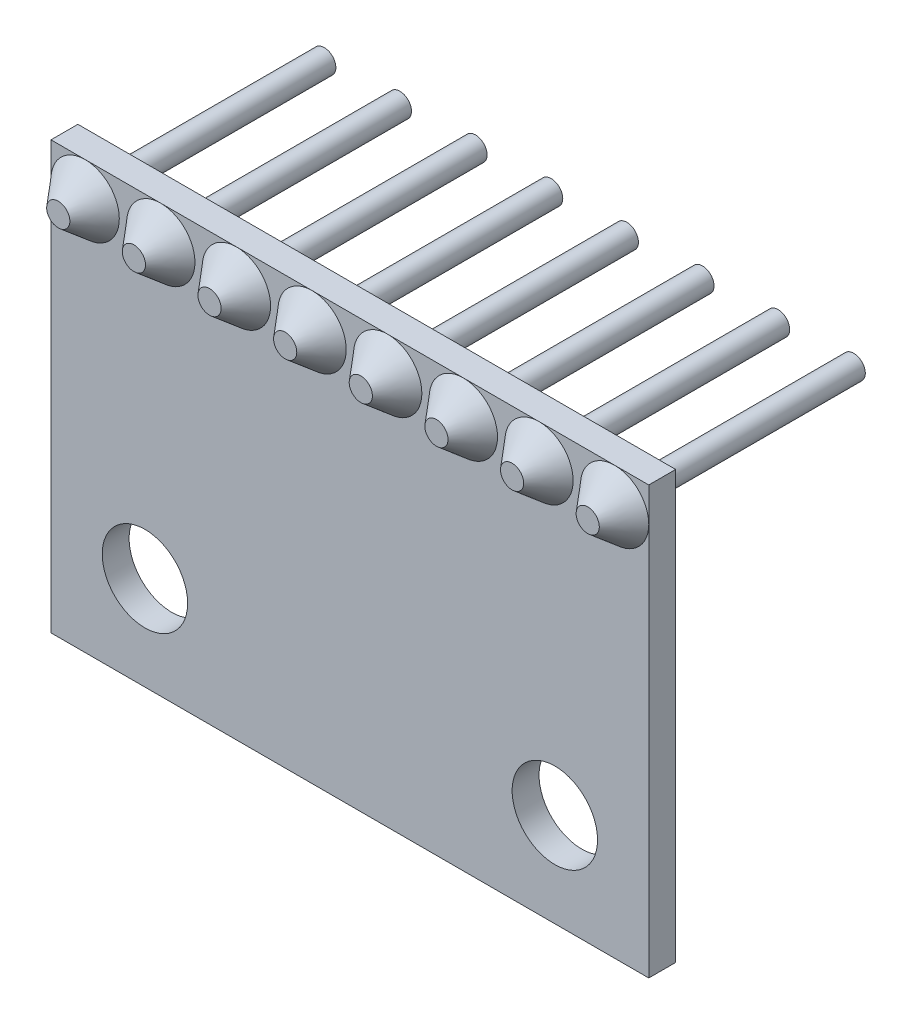
ISO-10303-21;
HEADER;
FILE_DESCRIPTION(('STEP AP214'),'2;1');
FILE_NAME('part.step','',(''),(''),'','','');
FILE_SCHEMA(('AUTOMOTIVE_DESIGN { 1 0 10303 214 1 1 1 1 }'));
ENDSEC;
DATA;
#1=APPLICATION_CONTEXT('core data for automotive mechanical design processes');
#2=APPLICATION_PROTOCOL_DEFINITION('international standard','automotive_design',2000,#1);
#3=PRODUCT_CONTEXT('',#1,'mechanical');
#4=PRODUCT('Part','Part','',(#3));
#5=PRODUCT_RELATED_PRODUCT_CATEGORY('part','',(#4));
#6=PRODUCT_DEFINITION_FORMATION('','',#4);
#7=PRODUCT_DEFINITION_CONTEXT('part definition',#1,'design');
#8=PRODUCT_DEFINITION('design','',#6,#7);
#9=PRODUCT_DEFINITION_SHAPE('','',#8);
#10=(LENGTH_UNIT() NAMED_UNIT(*) SI_UNIT(.MILLI.,.METRE.));
#11=(NAMED_UNIT(*) PLANE_ANGLE_UNIT() SI_UNIT($,.RADIAN.));
#12=(NAMED_UNIT(*) SI_UNIT($,.STERADIAN.) SOLID_ANGLE_UNIT());
#13=UNCERTAINTY_MEASURE_WITH_UNIT(LENGTH_MEASURE(1.E-05),#10,'distance_accuracy_value','');
#14=(GEOMETRIC_REPRESENTATION_CONTEXT(3) GLOBAL_UNCERTAINTY_ASSIGNED_CONTEXT((#13)) GLOBAL_UNIT_ASSIGNED_CONTEXT((#10,
#11,#12)) REPRESENTATION_CONTEXT('',''));
#15=CARTESIAN_POINT('',(0.,0.,0.));
#16=DIRECTION('',(0.,0.,1.));
#17=DIRECTION('',(1.,0.,0.));
#18=AXIS2_PLACEMENT_3D('',#15,#16,#17);
#19=CARTESIAN_POINT('',(0.,0.,1.));
#20=DIRECTION('',(0.,0.,1.));
#21=DIRECTION('',(1.,0.,0.));
#22=AXIS2_PLACEMENT_3D('',#19,#20,#21);
#23=PLANE('',#22);
#24=CARTESIAN_POINT('',(-3.4925,3.4925,1.));
#25=DIRECTION('',(0.,0.,1.));
#26=DIRECTION('',(1.,0.,0.));
#27=AXIS2_PLACEMENT_3D('',#24,#25,#26);
#28=CIRCLE('',#27,1.5875);
#29=CARTESIAN_POINT('',(-1.905,3.4925,1.));
#30=VERTEX_POINT('',#29);
#31=EDGE_CURVE('E251',#30,#30,#28,.T.);
#32=ORIENTED_EDGE('',*,*,#31,.F.);
#33=EDGE_LOOP('',(#32));
#34=FACE_BOUND('',#33,.T.);
#35=CARTESIAN_POINT('',(-18.7325,3.4925,1.));
#36=DIRECTION('',(0.,0.,1.));
#37=DIRECTION('',(1.,0.,0.));
#38=AXIS2_PLACEMENT_3D('',#35,#36,#37);
#39=CIRCLE('',#38,1.5875);
#40=CARTESIAN_POINT('',(-17.145,3.4925,1.));
#41=VERTEX_POINT('',#40);
#42=EDGE_CURVE('E257',#41,#41,#39,.T.);
#43=ORIENTED_EDGE('',*,*,#42,.F.);
#44=EDGE_LOOP('',(#43));
#45=FACE_BOUND('',#44,.T.);
#46=DIRECTION('',(0.,1.,0.));
#47=VECTOR('',#46,1.);
#48=CARTESIAN_POINT('',(0.,0.,1.));
#49=LINE('',#48,#47);
#50=CARTESIAN_POINT('',(0.,0.,1.));
#51=VERTEX_POINT('',#50);
#52=CARTESIAN_POINT('',(0.,14.605,1.));
#53=VERTEX_POINT('',#52);
#54=EDGE_CURVE('E135',#51,#53,#49,.T.);
#55=ORIENTED_EDGE('',*,*,#54,.T.);
#56=CARTESIAN_POINT('',(-1.27,14.605,1.));
#57=DIRECTION('',(0.,0.,1.));
#58=DIRECTION('',(1.,0.,0.));
#59=AXIS2_PLACEMENT_3D('',#56,#57,#58);
#60=CIRCLE('',#59,1.27);
#61=CARTESIAN_POINT('',(-1.27,15.875,1.));
#62=VERTEX_POINT('',#61);
#63=EDGE_CURVE('E47',#62,#53,#60,.T.);
#64=ORIENTED_EDGE('',*,*,#63,.F.);
#65=DIRECTION('',(-1.,0.,0.));
#66=VECTOR('',#65,1.);
#67=CARTESIAN_POINT('',(0.,15.875,1.));
#68=LINE('',#67,#66);
#69=CARTESIAN_POINT('',(-4.08214285714286,15.875,1.));
#70=VERTEX_POINT('',#69);
#71=EDGE_CURVE('E54',#62,#70,#68,.T.);
#72=ORIENTED_EDGE('',*,*,#71,.T.);
#73=CARTESIAN_POINT('',(-4.08214285714286,14.605,1.));
#74=DIRECTION('',(0.,0.,1.));
#75=DIRECTION('',(1.,0.,0.));
#76=AXIS2_PLACEMENT_3D('',#73,#74,#75);
#77=CIRCLE('',#76,1.27);
#78=EDGE_CURVE('E178',#70,#70,#77,.T.);
#79=ORIENTED_EDGE('',*,*,#78,.F.);
#80=CARTESIAN_POINT('',(-6.89428571428571,15.875,1.));
#81=VERTEX_POINT('',#80);
#82=EDGE_CURVE('E144',#70,#81,#68,.T.);
#83=ORIENTED_EDGE('',*,*,#82,.T.);
#84=CARTESIAN_POINT('',(-6.89428571428571,14.605,1.));
#85=DIRECTION('',(0.,0.,1.));
#86=DIRECTION('',(1.,0.,0.));
#87=AXIS2_PLACEMENT_3D('',#84,#85,#86);
#88=CIRCLE('',#87,1.27);
#89=EDGE_CURVE('E177',#81,#81,#88,.T.);
#90=ORIENTED_EDGE('',*,*,#89,.F.);
#91=CARTESIAN_POINT('',(-9.70642857142857,15.875,1.));
#92=VERTEX_POINT('',#91);
#93=EDGE_CURVE('E170',#81,#92,#68,.T.);
#94=ORIENTED_EDGE('',*,*,#93,.T.);
#95=CARTESIAN_POINT('',(-9.70642857142857,14.605,1.));
#96=DIRECTION('',(0.,0.,1.));
#97=DIRECTION('',(1.,0.,0.));
#98=AXIS2_PLACEMENT_3D('',#95,#96,#97);
#99=CIRCLE('',#98,1.27);
#100=EDGE_CURVE('E185',#92,#92,#99,.T.);
#101=ORIENTED_EDGE('',*,*,#100,.F.);
#102=CARTESIAN_POINT('',(-12.5185714285714,15.875,1.));
#103=VERTEX_POINT('',#102);
#104=EDGE_CURVE('E165',#92,#103,#68,.T.);
#105=ORIENTED_EDGE('',*,*,#104,.T.);
#106=CARTESIAN_POINT('',(-12.5185714285714,14.605,1.));
#107=DIRECTION('',(0.,0.,1.));
#108=DIRECTION('',(1.,0.,0.));
#109=AXIS2_PLACEMENT_3D('',#106,#107,#108);
#110=CIRCLE('',#109,1.27);
#111=EDGE_CURVE('E195',#103,#103,#110,.T.);
#112=ORIENTED_EDGE('',*,*,#111,.F.);
#113=CARTESIAN_POINT('',(-15.3307142857143,15.875,1.));
#114=VERTEX_POINT('',#113);
#115=EDGE_CURVE('E159',#103,#114,#68,.T.);
#116=ORIENTED_EDGE('',*,*,#115,.T.);
#117=CARTESIAN_POINT('',(-15.3307142857143,14.605,1.));
#118=DIRECTION('',(0.,0.,1.));
#119=DIRECTION('',(1.,0.,0.));
#120=AXIS2_PLACEMENT_3D('',#117,#118,#119);
#121=CIRCLE('',#120,1.27);
#122=EDGE_CURVE('E206',#114,#114,#121,.T.);
#123=ORIENTED_EDGE('',*,*,#122,.F.);
#124=CARTESIAN_POINT('',(-18.1428571428571,15.875,1.));
#125=VERTEX_POINT('',#124);
#126=EDGE_CURVE('E154',#114,#125,#68,.T.);
#127=ORIENTED_EDGE('',*,*,#126,.T.);
#128=CARTESIAN_POINT('',(-18.1428571428571,14.605,1.));
#129=DIRECTION('',(0.,0.,1.));
#130=DIRECTION('',(1.,0.,0.));
#131=AXIS2_PLACEMENT_3D('',#128,#129,#130);
#132=CIRCLE('',#131,1.27);
#133=EDGE_CURVE('E211',#125,#125,#132,.T.);
#134=ORIENTED_EDGE('',*,*,#133,.F.);
#135=CARTESIAN_POINT('',(-20.955,15.875,1.));
#136=VERTEX_POINT('',#135);
#137=EDGE_CURVE('E149',#125,#136,#68,.T.);
#138=ORIENTED_EDGE('',*,*,#137,.T.);
#139=CARTESIAN_POINT('',(-20.955,14.605,1.));
#140=DIRECTION('',(0.,0.,1.));
#141=DIRECTION('',(1.,0.,0.));
#142=AXIS2_PLACEMENT_3D('',#139,#140,#141);
#143=CIRCLE('',#142,1.27);
#144=CARTESIAN_POINT('',(-22.225,14.605,1.));
#145=VERTEX_POINT('',#144);
#146=EDGE_CURVE('E200',#145,#136,#143,.T.);
#147=ORIENTED_EDGE('',*,*,#146,.F.);
#148=DIRECTION('',(0.,-1.,0.));
#149=VECTOR('',#148,1.);
#150=CARTESIAN_POINT('',(-22.225,0.,1.));
#151=LINE('',#150,#149);
#152=CARTESIAN_POINT('',(-22.225,0.,1.));
#153=VERTEX_POINT('',#152);
#154=EDGE_CURVE('E148',#145,#153,#151,.T.);
#155=ORIENTED_EDGE('',*,*,#154,.T.);
#156=DIRECTION('',(1.,0.,0.));
#157=VECTOR('',#156,1.);
#158=CARTESIAN_POINT('',(0.,0.,1.));
#159=LINE('',#158,#157);
#160=EDGE_CURVE('E302',#153,#51,#159,.T.);
#161=ORIENTED_EDGE('',*,*,#160,.T.);
#162=EDGE_LOOP('',(#55,#64,#72,#79,#83,#90,#94,#101,#105,#112,#116,#123,#127,#134,#138,#147,
#155,#161));
#163=FACE_BOUND('',#162,.T.);
#164=ADVANCED_FACE('F33',(#34,#45,#163),#23,.T.);
#165=CARTESIAN_POINT('',(0.,15.875,1.));
#166=VERTEX_POINT('',#165);
#167=EDGE_CURVE('E141',#166,#62,#68,.T.);
#168=ORIENTED_EDGE('',*,*,#167,.T.);
#169=EDGE_CURVE('E126',#53,#62,#60,.T.);
#170=ORIENTED_EDGE('',*,*,#169,.F.);
#171=EDGE_CURVE('E147',#53,#166,#49,.T.);
#172=ORIENTED_EDGE('',*,*,#171,.T.);
#173=EDGE_LOOP('',(#168,#170,#172));
#174=FACE_BOUND('',#173,.T.);
#175=ADVANCED_FACE('F146',(#174),#23,.T.);
#176=CARTESIAN_POINT('',(-22.225,15.875,1.));
#177=VERTEX_POINT('',#176);
#178=EDGE_CURVE('E150',#177,#145,#151,.T.);
#179=ORIENTED_EDGE('',*,*,#178,.T.);
#180=EDGE_CURVE('E201',#136,#145,#143,.T.);
#181=ORIENTED_EDGE('',*,*,#180,.F.);
#182=EDGE_CURVE('E155',#136,#177,#68,.T.);
#183=ORIENTED_EDGE('',*,*,#182,.T.);
#184=EDGE_LOOP('',(#179,#181,#183));
#185=FACE_BOUND('',#184,.T.);
#186=ADVANCED_FACE('F286',(#185),#23,.T.);
#187=CARTESIAN_POINT('',(0.,0.,0.));
#188=DIRECTION('',(0.,0.,1.));
#189=DIRECTION('',(1.,0.,0.));
#190=AXIS2_PLACEMENT_3D('',#187,#188,#189);
#191=PLANE('',#190);
#192=CARTESIAN_POINT('',(-1.27,14.605,0.));
#193=DIRECTION('',(0.,0.,1.));
#194=DIRECTION('',(1.,0.,0.));
#195=AXIS2_PLACEMENT_3D('',#192,#193,#194);
#196=CIRCLE('',#195,0.430900368822718);
#197=CARTESIAN_POINT('',(-0.839099631177282,14.605,0.));
#198=VERTEX_POINT('',#197);
#199=EDGE_CURVE('E810',#198,#198,#196,.T.);
#200=ORIENTED_EDGE('',*,*,#199,.T.);
#201=EDGE_LOOP('',(#200));
#202=FACE_BOUND('',#201,.T.);
#203=CARTESIAN_POINT('',(-4.08214285714286,14.605,0.));
#204=DIRECTION('',(0.,0.,1.));
#205=DIRECTION('',(1.,0.,0.));
#206=AXIS2_PLACEMENT_3D('',#203,#204,#205);
#207=CIRCLE('',#206,0.430900368822718);
#208=CARTESIAN_POINT('',(-3.65124248832014,14.605,0.));
#209=VERTEX_POINT('',#208);
#210=EDGE_CURVE('E804',#209,#209,#207,.T.);
#211=ORIENTED_EDGE('',*,*,#210,.T.);
#212=EDGE_LOOP('',(#211));
#213=FACE_BOUND('',#212,.T.);
#214=CARTESIAN_POINT('',(-6.89428571428571,14.605,0.));
#215=DIRECTION('',(0.,0.,1.));
#216=DIRECTION('',(1.,0.,0.));
#217=AXIS2_PLACEMENT_3D('',#214,#215,#216);
#218=CIRCLE('',#217,0.430900368822718);
#219=CARTESIAN_POINT('',(-6.463385345463,14.605,0.));
#220=VERTEX_POINT('',#219);
#221=EDGE_CURVE('E798',#220,#220,#218,.T.);
#222=ORIENTED_EDGE('',*,*,#221,.T.);
#223=EDGE_LOOP('',(#222));
#224=FACE_BOUND('',#223,.T.);
#225=CARTESIAN_POINT('',(-9.70642857142857,14.605,0.));
#226=DIRECTION('',(0.,0.,1.));
#227=DIRECTION('',(1.,0.,0.));
#228=AXIS2_PLACEMENT_3D('',#225,#226,#227);
#229=CIRCLE('',#228,0.430900368822719);
#230=CARTESIAN_POINT('',(-9.27552820260585,14.605,0.));
#231=VERTEX_POINT('',#230);
#232=EDGE_CURVE('E792',#231,#231,#229,.T.);
#233=ORIENTED_EDGE('',*,*,#232,.T.);
#234=EDGE_LOOP('',(#233));
#235=FACE_BOUND('',#234,.T.);
#236=CARTESIAN_POINT('',(-12.5185714285714,14.605,0.));
#237=DIRECTION('',(0.,0.,1.));
#238=DIRECTION('',(1.,0.,0.));
#239=AXIS2_PLACEMENT_3D('',#236,#237,#238);
#240=CIRCLE('',#239,0.430900368822719);
#241=CARTESIAN_POINT('',(-12.0876710597487,14.605,0.));
#242=VERTEX_POINT('',#241);
#243=EDGE_CURVE('E786',#242,#242,#240,.T.);
#244=ORIENTED_EDGE('',*,*,#243,.T.);
#245=EDGE_LOOP('',(#244));
#246=FACE_BOUND('',#245,.T.);
#247=CARTESIAN_POINT('',(-15.3307142857143,14.605,0.));
#248=DIRECTION('',(0.,0.,1.));
#249=DIRECTION('',(1.,0.,0.));
#250=AXIS2_PLACEMENT_3D('',#247,#248,#249);
#251=CIRCLE('',#250,0.430900368822719);
#252=CARTESIAN_POINT('',(-14.8998139168916,14.605,0.));
#253=VERTEX_POINT('',#252);
#254=EDGE_CURVE('E780',#253,#253,#251,.T.);
#255=ORIENTED_EDGE('',*,*,#254,.T.);
#256=EDGE_LOOP('',(#255));
#257=FACE_BOUND('',#256,.T.);
#258=CARTESIAN_POINT('',(-18.1428571428571,14.605,0.));
#259=DIRECTION('',(0.,0.,1.));
#260=DIRECTION('',(1.,0.,0.));
#261=AXIS2_PLACEMENT_3D('',#258,#259,#260);
#262=CIRCLE('',#261,0.430900368822719);
#263=CARTESIAN_POINT('',(-17.7119567740344,14.605,0.));
#264=VERTEX_POINT('',#263);
#265=EDGE_CURVE('E774',#264,#264,#262,.T.);
#266=ORIENTED_EDGE('',*,*,#265,.T.);
#267=EDGE_LOOP('',(#266));
#268=FACE_BOUND('',#267,.T.);
#269=CARTESIAN_POINT('',(-20.955,14.605,0.));
#270=DIRECTION('',(0.,0.,1.));
#271=DIRECTION('',(1.,0.,0.));
#272=AXIS2_PLACEMENT_3D('',#269,#270,#271);
#273=CIRCLE('',#272,0.430900368822719);
#274=CARTESIAN_POINT('',(-20.5240996311773,14.605,0.));
#275=VERTEX_POINT('',#274);
#276=EDGE_CURVE('E136',#275,#275,#273,.T.);
#277=ORIENTED_EDGE('',*,*,#276,.T.);
#278=EDGE_LOOP('',(#277));
#279=FACE_BOUND('',#278,.T.);
#280=DIRECTION('',(-1.,0.,0.));
#281=VECTOR('',#280,1.);
#282=CARTESIAN_POINT('',(-9.6125,11.8127155405457,0.));
#283=LINE('',#282,#281);
#284=CARTESIAN_POINT('',(-9.6125,11.8127155405457,0.));
#285=VERTEX_POINT('',#284);
#286=CARTESIAN_POINT('',(-12.6125,11.8127155405457,0.));
#287=VERTEX_POINT('',#286);
#288=EDGE_CURVE('E222',#285,#287,#283,.T.);
#289=ORIENTED_EDGE('',*,*,#288,.T.);
#290=DIRECTION('',(0.,-1.,0.));
#291=VECTOR('',#290,1.);
#292=CARTESIAN_POINT('',(-12.6125,11.8127155405457,0.));
#293=LINE('',#292,#291);
#294=CARTESIAN_POINT('',(-12.6125,7.81271554054567,0.));
#295=VERTEX_POINT('',#294);
#296=EDGE_CURVE('E217',#287,#295,#293,.T.);
#297=ORIENTED_EDGE('',*,*,#296,.T.);
#298=DIRECTION('',(1.,0.,0.));
#299=VECTOR('',#298,1.);
#300=CARTESIAN_POINT('',(-12.6125,7.81271554054567,0.));
#301=LINE('',#300,#299);
#302=CARTESIAN_POINT('',(-9.6125,7.81271554054567,0.));
#303=VERTEX_POINT('',#302);
#304=EDGE_CURVE('E234',#295,#303,#301,.T.);
#305=ORIENTED_EDGE('',*,*,#304,.T.);
#306=DIRECTION('',(0.,1.,0.));
#307=VECTOR('',#306,1.);
#308=CARTESIAN_POINT('',(-9.6125,11.8127155405457,0.));
#309=LINE('',#308,#307);
#310=EDGE_CURVE('E237',#303,#285,#309,.T.);
#311=ORIENTED_EDGE('',*,*,#310,.T.);
#312=EDGE_LOOP('',(#289,#297,#305,#311));
#313=FACE_BOUND('',#312,.T.);
#314=CARTESIAN_POINT('',(-18.7325,3.4925,0.));
#315=DIRECTION('',(0.,0.,1.));
#316=DIRECTION('',(1.,0.,0.));
#317=AXIS2_PLACEMENT_3D('',#314,#315,#316);
#318=CIRCLE('',#317,1.5875);
#319=CARTESIAN_POINT('',(-17.145,3.4925,0.));
#320=VERTEX_POINT('',#319);
#321=EDGE_CURVE('E254',#320,#320,#318,.T.);
#322=ORIENTED_EDGE('',*,*,#321,.T.);
#323=EDGE_LOOP('',(#322));
#324=FACE_BOUND('',#323,.T.);
#325=DIRECTION('',(0.,1.,0.));
#326=VECTOR('',#325,1.);
#327=CARTESIAN_POINT('',(0.,0.,0.));
#328=LINE('',#327,#326);
#329=CARTESIAN_POINT('',(0.,0.,0.));
#330=VERTEX_POINT('',#329);
#331=CARTESIAN_POINT('',(0.,15.875,0.));
#332=VERTEX_POINT('',#331);
#333=EDGE_CURVE('E260',#330,#332,#328,.T.);
#334=ORIENTED_EDGE('',*,*,#333,.F.);
#335=DIRECTION('',(1.,0.,0.));
#336=VECTOR('',#335,1.);
#337=CARTESIAN_POINT('',(0.,0.,0.));
#338=LINE('',#337,#336);
#339=CARTESIAN_POINT('',(-22.225,0.,0.));
#340=VERTEX_POINT('',#339);
#341=EDGE_CURVE('E312',#340,#330,#338,.T.);
#342=ORIENTED_EDGE('',*,*,#341,.F.);
#343=DIRECTION('',(0.,-1.,0.));
#344=VECTOR('',#343,1.);
#345=CARTESIAN_POINT('',(-22.225,0.,0.));
#346=LINE('',#345,#344);
#347=CARTESIAN_POINT('',(-22.225,15.875,0.));
#348=VERTEX_POINT('',#347);
#349=EDGE_CURVE('E310',#348,#340,#346,.T.);
#350=ORIENTED_EDGE('',*,*,#349,.F.);
#351=DIRECTION('',(-1.,0.,0.));
#352=VECTOR('',#351,1.);
#353=CARTESIAN_POINT('',(0.,15.875,0.));
#354=LINE('',#353,#352);
#355=EDGE_CURVE('E308',#332,#348,#354,.T.);
#356=ORIENTED_EDGE('',*,*,#355,.F.);
#357=EDGE_LOOP('',(#334,#342,#350,#356));
#358=FACE_BOUND('',#357,.T.);
#359=CARTESIAN_POINT('',(-3.4925,3.4925,0.));
#360=DIRECTION('',(0.,0.,1.));
#361=DIRECTION('',(1.,0.,0.));
#362=AXIS2_PLACEMENT_3D('',#359,#360,#361);
#363=CIRCLE('',#362,1.5875);
#364=CARTESIAN_POINT('',(-1.905,3.4925,0.));
#365=VERTEX_POINT('',#364);
#366=EDGE_CURVE('E244',#365,#365,#363,.T.);
#367=ORIENTED_EDGE('',*,*,#366,.T.);
#368=EDGE_LOOP('',(#367));
#369=FACE_BOUND('',#368,.T.);
#370=ADVANCED_FACE('F264',(#202,#213,#224,#235,#246,#257,#268,#279,#313,#324,#358,#369),#191,.F.);
#371=CARTESIAN_POINT('',(0.,0.,1.));
#372=DIRECTION('',(-1.,0.,0.));
#373=DIRECTION('',(0.,0.,1.));
#374=AXIS2_PLACEMENT_3D('',#371,#372,#373);
#375=PLANE('',#374);
#376=ORIENTED_EDGE('',*,*,#333,.T.);
#377=DIRECTION('',(0.,0.,-1.));
#378=VECTOR('',#377,1.);
#379=CARTESIAN_POINT('',(0.,15.875,1.));
#380=LINE('',#379,#378);
#381=EDGE_CURVE('E11',#166,#332,#380,.T.);
#382=ORIENTED_EDGE('',*,*,#381,.F.);
#383=ORIENTED_EDGE('',*,*,#171,.F.);
#384=ORIENTED_EDGE('',*,*,#54,.F.);
#385=DIRECTION('',(0.,0.,-1.));
#386=VECTOR('',#385,1.);
#387=CARTESIAN_POINT('',(0.,0.,1.));
#388=LINE('',#387,#386);
#389=EDGE_CURVE('E303',#51,#330,#388,.T.);
#390=ORIENTED_EDGE('',*,*,#389,.T.);
#391=EDGE_LOOP('',(#376,#382,#383,#384,#390));
#392=FACE_BOUND('',#391,.T.);
#393=ADVANCED_FACE('F35',(#392),#375,.F.);
#394=CARTESIAN_POINT('',(0.,15.875,1.));
#395=DIRECTION('',(0.,-1.,0.));
#396=DIRECTION('',(1.,0.,0.));
#397=AXIS2_PLACEMENT_3D('',#394,#395,#396);
#398=PLANE('',#397);
#399=ORIENTED_EDGE('',*,*,#355,.T.);
#400=DIRECTION('',(0.,0.,-1.));
#401=VECTOR('',#400,1.);
#402=CARTESIAN_POINT('',(-22.225,15.875,1.));
#403=LINE('',#402,#401);
#404=EDGE_CURVE('E41',#177,#348,#403,.T.);
#405=ORIENTED_EDGE('',*,*,#404,.F.);
#406=ORIENTED_EDGE('',*,*,#182,.F.);
#407=ORIENTED_EDGE('',*,*,#137,.F.);
#408=ORIENTED_EDGE('',*,*,#126,.F.);
#409=ORIENTED_EDGE('',*,*,#115,.F.);
#410=ORIENTED_EDGE('',*,*,#104,.F.);
#411=ORIENTED_EDGE('',*,*,#93,.F.);
#412=ORIENTED_EDGE('',*,*,#82,.F.);
#413=ORIENTED_EDGE('',*,*,#71,.F.);
#414=ORIENTED_EDGE('',*,*,#167,.F.);
#415=ORIENTED_EDGE('',*,*,#381,.T.);
#416=EDGE_LOOP('',(#399,#405,#406,#407,#408,#409,#410,#411,#412,#413,#414,#415));
#417=FACE_BOUND('',#416,.T.);
#418=ADVANCED_FACE('F140',(#417),#398,.F.);
#419=CARTESIAN_POINT('',(-22.225,0.,1.));
#420=DIRECTION('',(1.,0.,0.));
#421=DIRECTION('',(0.,0.,-1.));
#422=AXIS2_PLACEMENT_3D('',#419,#420,#421);
#423=PLANE('',#422);
#424=ORIENTED_EDGE('',*,*,#349,.T.);
#425=DIRECTION('',(0.,0.,-1.));
#426=VECTOR('',#425,1.);
#427=CARTESIAN_POINT('',(-22.225,0.,1.));
#428=LINE('',#427,#426);
#429=EDGE_CURVE('E316',#153,#340,#428,.T.);
#430=ORIENTED_EDGE('',*,*,#429,.F.);
#431=ORIENTED_EDGE('',*,*,#154,.F.);
#432=ORIENTED_EDGE('',*,*,#178,.F.);
#433=ORIENTED_EDGE('',*,*,#404,.T.);
#434=EDGE_LOOP('',(#424,#430,#431,#432,#433));
#435=FACE_BOUND('',#434,.T.);
#436=ADVANCED_FACE('F280',(#435),#423,.F.);
#437=CARTESIAN_POINT('',(0.,0.,1.));
#438=DIRECTION('',(0.,1.,0.));
#439=DIRECTION('',(0.,0.,1.));
#440=AXIS2_PLACEMENT_3D('',#437,#438,#439);
#441=PLANE('',#440);
#442=ORIENTED_EDGE('',*,*,#341,.T.);
#443=ORIENTED_EDGE('',*,*,#389,.F.);
#444=ORIENTED_EDGE('',*,*,#160,.F.);
#445=ORIENTED_EDGE('',*,*,#429,.T.);
#446=EDGE_LOOP('',(#442,#443,#444,#445));
#447=FACE_BOUND('',#446,.T.);
#448=ADVANCED_FACE('F270',(#447),#441,.F.);
#449=CARTESIAN_POINT('',(-18.7325,3.4925,1.));
#450=DIRECTION('',(0.,0.,-1.));
#451=DIRECTION('',(-1.,0.,0.));
#452=AXIS2_PLACEMENT_3D('',#449,#450,#451);
#453=CYLINDRICAL_SURFACE('',#452,1.5875);
#454=ORIENTED_EDGE('',*,*,#42,.T.);
#455=EDGE_LOOP('',(#454));
#456=FACE_BOUND('',#455,.T.);
#457=ORIENTED_EDGE('',*,*,#321,.F.);
#458=EDGE_LOOP('',(#457));
#459=FACE_BOUND('',#458,.T.);
#460=ADVANCED_FACE('F267',(#456,#459),#453,.F.);
#461=CARTESIAN_POINT('',(-3.4925,3.4925,1.));
#462=DIRECTION('',(0.,0.,-1.));
#463=DIRECTION('',(-1.,0.,0.));
#464=AXIS2_PLACEMENT_3D('',#461,#462,#463);
#465=CYLINDRICAL_SURFACE('',#464,1.5875);
#466=ORIENTED_EDGE('',*,*,#31,.T.);
#467=EDGE_LOOP('',(#466));
#468=FACE_BOUND('',#467,.T.);
#469=ORIENTED_EDGE('',*,*,#366,.F.);
#470=EDGE_LOOP('',(#469));
#471=FACE_BOUND('',#470,.T.);
#472=ADVANCED_FACE('F269',(#468,#471),#465,.F.);
#473=CARTESIAN_POINT('',(-12.6125,11.8127155405457,-1.));
#474=DIRECTION('',(-1.,0.,0.));
#475=DIRECTION('',(0.,0.,1.));
#476=AXIS2_PLACEMENT_3D('',#473,#474,#475);
#477=PLANE('',#476);
#478=ORIENTED_EDGE('',*,*,#296,.F.);
#479=DIRECTION('',(0.,0.,1.));
#480=VECTOR('',#479,1.);
#481=CARTESIAN_POINT('',(-12.6125,11.8127155405457,-1.));
#482=LINE('',#481,#480);
#483=CARTESIAN_POINT('',(-12.6125,11.8127155405457,-1.));
#484=VERTEX_POINT('',#483);
#485=EDGE_CURVE('E242',#484,#287,#482,.T.);
#486=ORIENTED_EDGE('',*,*,#485,.F.);
#487=DIRECTION('',(0.,-1.,0.));
#488=VECTOR('',#487,1.);
#489=CARTESIAN_POINT('',(-12.6125,11.8127155405457,-1.));
#490=LINE('',#489,#488);
#491=CARTESIAN_POINT('',(-12.6125,7.81271554054567,-1.));
#492=VERTEX_POINT('',#491);
#493=EDGE_CURVE('E218',#484,#492,#490,.T.);
#494=ORIENTED_EDGE('',*,*,#493,.T.);
#495=DIRECTION('',(0.,0.,1.));
#496=VECTOR('',#495,1.);
#497=CARTESIAN_POINT('',(-12.6125,7.81271554054567,-1.));
#498=LINE('',#497,#496);
#499=EDGE_CURVE('E231',#492,#295,#498,.T.);
#500=ORIENTED_EDGE('',*,*,#499,.T.);
#501=EDGE_LOOP('',(#478,#486,#494,#500));
#502=FACE_BOUND('',#501,.T.);
#503=ADVANCED_FACE('F277',(#502),#477,.T.);
#504=CARTESIAN_POINT('',(-9.6125,11.8127155405457,-1.));
#505=DIRECTION('',(0.,1.,0.));
#506=DIRECTION('',(0.,0.,1.));
#507=AXIS2_PLACEMENT_3D('',#504,#505,#506);
#508=PLANE('',#507);
#509=ORIENTED_EDGE('',*,*,#288,.F.);
#510=DIRECTION('',(0.,0.,1.));
#511=VECTOR('',#510,1.);
#512=CARTESIAN_POINT('',(-9.6125,11.8127155405457,-1.));
#513=LINE('',#512,#511);
#514=CARTESIAN_POINT('',(-9.6125,11.8127155405457,-1.));
#515=VERTEX_POINT('',#514);
#516=EDGE_CURVE('E245',#515,#285,#513,.T.);
#517=ORIENTED_EDGE('',*,*,#516,.F.);
#518=DIRECTION('',(-1.,0.,0.));
#519=VECTOR('',#518,1.);
#520=CARTESIAN_POINT('',(-9.6125,11.8127155405457,-1.));
#521=LINE('',#520,#519);
#522=EDGE_CURVE('E228',#515,#484,#521,.T.);
#523=ORIENTED_EDGE('',*,*,#522,.T.);
#524=ORIENTED_EDGE('',*,*,#485,.T.);
#525=EDGE_LOOP('',(#509,#517,#523,#524));
#526=FACE_BOUND('',#525,.T.);
#527=ADVANCED_FACE('F360',(#526),#508,.T.);
#528=CARTESIAN_POINT('',(-9.6125,11.8127155405457,-1.));
#529=DIRECTION('',(1.,0.,0.));
#530=DIRECTION('',(0.,0.,-1.));
#531=AXIS2_PLACEMENT_3D('',#528,#529,#530);
#532=PLANE('',#531);
#533=ORIENTED_EDGE('',*,*,#310,.F.);
#534=DIRECTION('',(0.,0.,1.));
#535=VECTOR('',#534,1.);
#536=CARTESIAN_POINT('',(-9.6125,7.81271554054567,-1.));
#537=LINE('',#536,#535);
#538=CARTESIAN_POINT('',(-9.6125,7.81271554054567,-1.));
#539=VERTEX_POINT('',#538);
#540=EDGE_CURVE('E247',#539,#303,#537,.T.);
#541=ORIENTED_EDGE('',*,*,#540,.F.);
#542=DIRECTION('',(0.,1.,0.));
#543=VECTOR('',#542,1.);
#544=CARTESIAN_POINT('',(-9.6125,11.8127155405457,-1.));
#545=LINE('',#544,#543);
#546=EDGE_CURVE('E225',#539,#515,#545,.T.);
#547=ORIENTED_EDGE('',*,*,#546,.T.);
#548=ORIENTED_EDGE('',*,*,#516,.T.);
#549=EDGE_LOOP('',(#533,#541,#547,#548));
#550=FACE_BOUND('',#549,.T.);
#551=ADVANCED_FACE('F370',(#550),#532,.T.);
#552=CARTESIAN_POINT('',(-12.6125,7.81271554054567,-1.));
#553=DIRECTION('',(0.,-1.,0.));
#554=DIRECTION('',(0.,0.,-1.));
#555=AXIS2_PLACEMENT_3D('',#552,#553,#554);
#556=PLANE('',#555);
#557=ORIENTED_EDGE('',*,*,#304,.F.);
#558=ORIENTED_EDGE('',*,*,#499,.F.);
#559=DIRECTION('',(1.,0.,0.));
#560=VECTOR('',#559,1.);
#561=CARTESIAN_POINT('',(-12.6125,7.81271554054567,-1.));
#562=LINE('',#561,#560);
#563=EDGE_CURVE('E221',#492,#539,#562,.T.);
#564=ORIENTED_EDGE('',*,*,#563,.T.);
#565=ORIENTED_EDGE('',*,*,#540,.T.);
#566=EDGE_LOOP('',(#557,#558,#564,#565));
#567=FACE_BOUND('',#566,.T.);
#568=ADVANCED_FACE('F380',(#567),#556,.T.);
#569=CARTESIAN_POINT('',(0.,0.,-1.));
#570=DIRECTION('',(0.,0.,1.));
#571=DIRECTION('',(1.,0.,0.));
#572=AXIS2_PLACEMENT_3D('',#569,#570,#571);
#573=PLANE('',#572);
#574=ORIENTED_EDGE('',*,*,#493,.F.);
#575=ORIENTED_EDGE('',*,*,#522,.F.);
#576=ORIENTED_EDGE('',*,*,#546,.F.);
#577=ORIENTED_EDGE('',*,*,#563,.F.);
#578=EDGE_LOOP('',(#574,#575,#576,#577));
#579=FACE_BOUND('',#578,.T.);
#580=ADVANCED_FACE('F390',(#579),#573,.F.);
#581=CARTESIAN_POINT('',(-18.1428571428571,14.605,1.));
#582=DIRECTION('',(0.,0.,-1.));
#583=DIRECTION('',(1.,0.,0.));
#584=AXIS2_PLACEMENT_3D('',#581,#582,#583);
#585=CONICAL_SURFACE('',#584,1.27,0.698131700797733);
#586=CARTESIAN_POINT('',(-18.1428571428571,14.605,2.));
#587=DIRECTION('',(0.,0.,1.));
#588=DIRECTION('',(1.,0.,0.));
#589=AXIS2_PLACEMENT_3D('',#586,#587,#588);
#590=CIRCLE('',#589,0.430900368822719);
#591=CARTESIAN_POINT('',(-17.7119567740344,14.605,2.));
#592=VERTEX_POINT('',#591);
#593=EDGE_CURVE('E214',#592,#592,#590,.T.);
#594=ORIENTED_EDGE('',*,*,#593,.F.);
#595=EDGE_LOOP('',(#594));
#596=FACE_BOUND('',#595,.T.);
#597=ORIENTED_EDGE('',*,*,#133,.T.);
#598=EDGE_LOOP('',(#597));
#599=FACE_BOUND('',#598,.T.);
#600=ADVANCED_FACE('F399',(#596,#599),#585,.T.);
#601=CARTESIAN_POINT('',(-18.1428571428571,14.605,2.));
#602=DIRECTION('',(0.,0.,1.));
#603=DIRECTION('',(1.,0.,0.));
#604=AXIS2_PLACEMENT_3D('',#601,#602,#603);
#605=PLANE('',#604);
#606=ORIENTED_EDGE('',*,*,#593,.T.);
#607=EDGE_LOOP('',(#606));
#608=FACE_BOUND('',#607,.T.);
#609=ADVANCED_FACE('F656',(#608),#605,.T.);
#610=CARTESIAN_POINT('',(-15.3307142857143,14.605,1.));
#611=DIRECTION('',(0.,0.,-1.));
#612=DIRECTION('',(1.,0.,0.));
#613=AXIS2_PLACEMENT_3D('',#610,#611,#612);
#614=CONICAL_SURFACE('',#613,1.27,0.698131700797733);
#615=CARTESIAN_POINT('',(-15.3307142857143,14.605,2.));
#616=DIRECTION('',(0.,0.,1.));
#617=DIRECTION('',(1.,0.,0.));
#618=AXIS2_PLACEMENT_3D('',#615,#616,#617);
#619=CIRCLE('',#618,0.430900368822719);
#620=CARTESIAN_POINT('',(-14.8998139168916,14.605,2.));
#621=VERTEX_POINT('',#620);
#622=EDGE_CURVE('E208',#621,#621,#619,.T.);
#623=ORIENTED_EDGE('',*,*,#622,.F.);
#624=EDGE_LOOP('',(#623));
#625=FACE_BOUND('',#624,.T.);
#626=ORIENTED_EDGE('',*,*,#122,.T.);
#627=EDGE_LOOP('',(#626));
#628=FACE_BOUND('',#627,.T.);
#629=ADVANCED_FACE('F652',(#625,#628),#614,.T.);
#630=CARTESIAN_POINT('',(-15.3307142857143,14.605,2.));
#631=DIRECTION('',(0.,0.,1.));
#632=DIRECTION('',(1.,0.,0.));
#633=AXIS2_PLACEMENT_3D('',#630,#631,#632);
#634=PLANE('',#633);
#635=ORIENTED_EDGE('',*,*,#622,.T.);
#636=EDGE_LOOP('',(#635));
#637=FACE_BOUND('',#636,.T.);
#638=ADVANCED_FACE('F648',(#637),#634,.T.);
#639=CARTESIAN_POINT('',(-20.955,14.605,1.));
#640=DIRECTION('',(0.,0.,-1.));
#641=DIRECTION('',(1.,0.,0.));
#642=AXIS2_PLACEMENT_3D('',#639,#640,#641);
#643=CONICAL_SURFACE('',#642,1.27,0.698131700797733);
#644=CARTESIAN_POINT('',(-20.955,14.605,2.));
#645=DIRECTION('',(0.,0.,1.));
#646=DIRECTION('',(1.,0.,0.));
#647=AXIS2_PLACEMENT_3D('',#644,#645,#646);
#648=CIRCLE('',#647,0.430900368822719);
#649=CARTESIAN_POINT('',(-20.5240996311773,14.605,2.));
#650=VERTEX_POINT('',#649);
#651=EDGE_CURVE('E203',#650,#650,#648,.T.);
#652=ORIENTED_EDGE('',*,*,#651,.F.);
#653=EDGE_LOOP('',(#652));
#654=FACE_BOUND('',#653,.T.);
#655=ORIENTED_EDGE('',*,*,#180,.T.);
#656=ORIENTED_EDGE('',*,*,#146,.T.);
#657=EDGE_LOOP('',(#655,#656));
#658=FACE_BOUND('',#657,.T.);
#659=ADVANCED_FACE('F644',(#654,#658),#643,.T.);
#660=CARTESIAN_POINT('',(-20.955,14.605,2.));
#661=DIRECTION('',(0.,0.,1.));
#662=DIRECTION('',(1.,0.,0.));
#663=AXIS2_PLACEMENT_3D('',#660,#661,#662);
#664=PLANE('',#663);
#665=ORIENTED_EDGE('',*,*,#651,.T.);
#666=EDGE_LOOP('',(#665));
#667=FACE_BOUND('',#666,.T.);
#668=ADVANCED_FACE('F640',(#667),#664,.T.);
#669=CARTESIAN_POINT('',(-12.5185714285714,14.605,1.));
#670=DIRECTION('',(0.,0.,-1.));
#671=DIRECTION('',(1.,0.,0.));
#672=AXIS2_PLACEMENT_3D('',#669,#670,#671);
#673=CONICAL_SURFACE('',#672,1.27,0.698131700797733);
#674=CARTESIAN_POINT('',(-12.5185714285714,14.605,2.));
#675=DIRECTION('',(0.,0.,1.));
#676=DIRECTION('',(1.,0.,0.));
#677=AXIS2_PLACEMENT_3D('',#674,#675,#676);
#678=CIRCLE('',#677,0.430900368822719);
#679=CARTESIAN_POINT('',(-12.0876710597487,14.605,2.));
#680=VERTEX_POINT('',#679);
#681=EDGE_CURVE('E197',#680,#680,#678,.T.);
#682=ORIENTED_EDGE('',*,*,#681,.F.);
#683=EDGE_LOOP('',(#682));
#684=FACE_BOUND('',#683,.T.);
#685=ORIENTED_EDGE('',*,*,#111,.T.);
#686=EDGE_LOOP('',(#685));
#687=FACE_BOUND('',#686,.T.);
#688=ADVANCED_FACE('F636',(#684,#687),#673,.T.);
#689=CARTESIAN_POINT('',(-12.5185714285714,14.605,2.));
#690=DIRECTION('',(0.,0.,1.));
#691=DIRECTION('',(1.,0.,0.));
#692=AXIS2_PLACEMENT_3D('',#689,#690,#691);
#693=PLANE('',#692);
#694=ORIENTED_EDGE('',*,*,#681,.T.);
#695=EDGE_LOOP('',(#694));
#696=FACE_BOUND('',#695,.T.);
#697=ADVANCED_FACE('F632',(#696),#693,.T.);
#698=CARTESIAN_POINT('',(-9.70642857142857,14.605,1.));
#699=DIRECTION('',(0.,0.,-1.));
#700=DIRECTION('',(1.,0.,0.));
#701=AXIS2_PLACEMENT_3D('',#698,#699,#700);
#702=CONICAL_SURFACE('',#701,1.27,0.698131700797733);
#703=CARTESIAN_POINT('',(-9.70642857142857,14.605,2.));
#704=DIRECTION('',(0.,0.,1.));
#705=DIRECTION('',(1.,0.,0.));
#706=AXIS2_PLACEMENT_3D('',#703,#704,#705);
#707=CIRCLE('',#706,0.430900368822719);
#708=CARTESIAN_POINT('',(-9.27552820260585,14.605,2.));
#709=VERTEX_POINT('',#708);
#710=EDGE_CURVE('E192',#709,#709,#707,.T.);
#711=ORIENTED_EDGE('',*,*,#710,.F.);
#712=EDGE_LOOP('',(#711));
#713=FACE_BOUND('',#712,.T.);
#714=ORIENTED_EDGE('',*,*,#100,.T.);
#715=EDGE_LOOP('',(#714));
#716=FACE_BOUND('',#715,.T.);
#717=ADVANCED_FACE('F628',(#713,#716),#702,.T.);
#718=CARTESIAN_POINT('',(-9.70642857142857,14.605,2.));
#719=DIRECTION('',(0.,0.,1.));
#720=DIRECTION('',(1.,0.,0.));
#721=AXIS2_PLACEMENT_3D('',#718,#719,#720);
#722=PLANE('',#721);
#723=ORIENTED_EDGE('',*,*,#710,.T.);
#724=EDGE_LOOP('',(#723));
#725=FACE_BOUND('',#724,.T.);
#726=ADVANCED_FACE('F624',(#725),#722,.T.);
#727=CARTESIAN_POINT('',(-6.89428571428571,14.605,1.));
#728=DIRECTION('',(0.,0.,-1.));
#729=DIRECTION('',(1.,0.,0.));
#730=AXIS2_PLACEMENT_3D('',#727,#728,#729);
#731=CONICAL_SURFACE('',#730,1.27,0.698131700797733);
#732=CARTESIAN_POINT('',(-6.89428571428571,14.605,2.));
#733=DIRECTION('',(0.,0.,1.));
#734=DIRECTION('',(1.,0.,0.));
#735=AXIS2_PLACEMENT_3D('',#732,#733,#734);
#736=CIRCLE('',#735,0.430900368822718);
#737=CARTESIAN_POINT('',(-6.463385345463,14.605,2.));
#738=VERTEX_POINT('',#737);
#739=EDGE_CURVE('E181',#738,#738,#736,.T.);
#740=ORIENTED_EDGE('',*,*,#739,.F.);
#741=EDGE_LOOP('',(#740));
#742=FACE_BOUND('',#741,.T.);
#743=ORIENTED_EDGE('',*,*,#89,.T.);
#744=EDGE_LOOP('',(#743));
#745=FACE_BOUND('',#744,.T.);
#746=ADVANCED_FACE('F180',(#742,#745),#731,.T.);
#747=CARTESIAN_POINT('',(-6.89428571428571,14.605,2.));
#748=DIRECTION('',(0.,0.,1.));
#749=DIRECTION('',(1.,0.,0.));
#750=AXIS2_PLACEMENT_3D('',#747,#748,#749);
#751=PLANE('',#750);
#752=ORIENTED_EDGE('',*,*,#739,.T.);
#753=EDGE_LOOP('',(#752));
#754=FACE_BOUND('',#753,.T.);
#755=ADVANCED_FACE('F617',(#754),#751,.T.);
#756=CARTESIAN_POINT('',(-4.08214285714286,14.605,1.));
#757=DIRECTION('',(0.,0.,-1.));
#758=DIRECTION('',(1.,0.,0.));
#759=AXIS2_PLACEMENT_3D('',#756,#757,#758);
#760=CONICAL_SURFACE('',#759,1.27,0.698131700797733);
#761=CARTESIAN_POINT('',(-4.08214285714286,14.605,2.));
#762=DIRECTION('',(0.,0.,1.));
#763=DIRECTION('',(1.,0.,0.));
#764=AXIS2_PLACEMENT_3D('',#761,#762,#763);
#765=CIRCLE('',#764,0.430900368822718);
#766=CARTESIAN_POINT('',(-3.65124248832014,14.605,2.));
#767=VERTEX_POINT('',#766);
#768=EDGE_CURVE('E182',#767,#767,#765,.T.);
#769=ORIENTED_EDGE('',*,*,#768,.F.);
#770=EDGE_LOOP('',(#769));
#771=FACE_BOUND('',#770,.T.);
#772=ORIENTED_EDGE('',*,*,#78,.T.);
#773=EDGE_LOOP('',(#772));
#774=FACE_BOUND('',#773,.T.);
#775=ADVANCED_FACE('F613',(#771,#774),#760,.T.);
#776=CARTESIAN_POINT('',(-4.08214285714286,14.605,2.));
#777=DIRECTION('',(0.,0.,1.));
#778=DIRECTION('',(1.,0.,0.));
#779=AXIS2_PLACEMENT_3D('',#776,#777,#778);
#780=PLANE('',#779);
#781=ORIENTED_EDGE('',*,*,#768,.T.);
#782=EDGE_LOOP('',(#781));
#783=FACE_BOUND('',#782,.T.);
#784=ADVANCED_FACE('F609',(#783),#780,.T.);
#785=CARTESIAN_POINT('',(-1.27,14.605,1.));
#786=DIRECTION('',(0.,0.,-1.));
#787=DIRECTION('',(1.,0.,0.));
#788=AXIS2_PLACEMENT_3D('',#785,#786,#787);
#789=CONICAL_SURFACE('',#788,1.27,0.698131700797733);
#790=CARTESIAN_POINT('',(-1.27,14.605,2.));
#791=DIRECTION('',(0.,0.,1.));
#792=DIRECTION('',(1.,0.,0.));
#793=AXIS2_PLACEMENT_3D('',#790,#791,#792);
#794=CIRCLE('',#793,0.430900368822718);
#795=CARTESIAN_POINT('',(-0.839099631177282,14.605,2.));
#796=VERTEX_POINT('',#795);
#797=EDGE_CURVE('E131',#796,#796,#794,.T.);
#798=ORIENTED_EDGE('',*,*,#797,.F.);
#799=EDGE_LOOP('',(#798));
#800=FACE_BOUND('',#799,.T.);
#801=ORIENTED_EDGE('',*,*,#169,.T.);
#802=ORIENTED_EDGE('',*,*,#63,.T.);
#803=EDGE_LOOP('',(#801,#802));
#804=FACE_BOUND('',#803,.T.);
#805=ADVANCED_FACE('F127',(#800,#804),#789,.T.);
#806=CARTESIAN_POINT('',(-1.27,14.605,2.));
#807=DIRECTION('',(0.,0.,1.));
#808=DIRECTION('',(1.,0.,0.));
#809=AXIS2_PLACEMENT_3D('',#806,#807,#808);
#810=PLANE('',#809);
#811=ORIENTED_EDGE('',*,*,#797,.T.);
#812=EDGE_LOOP('',(#811));
#813=FACE_BOUND('',#812,.T.);
#814=ADVANCED_FACE('F439',(#813),#810,.T.);
#815=CARTESIAN_POINT('',(-20.955,14.605,-7.89000000000001));
#816=DIRECTION('',(0.,0.,1.));
#817=DIRECTION('',(1.,0.,0.));
#818=AXIS2_PLACEMENT_3D('',#815,#816,#817);
#819=CYLINDRICAL_SURFACE('',#818,0.430900368822719);
#820=CARTESIAN_POINT('',(-20.955,14.605,-7.89000000000001));
#821=DIRECTION('',(0.,0.,1.));
#822=DIRECTION('',(1.,0.,0.));
#823=AXIS2_PLACEMENT_3D('',#820,#821,#822);
#824=CIRCLE('',#823,0.430900368822719);
#825=CARTESIAN_POINT('',(-20.5240996311773,14.605,-7.89000000000001));
#826=VERTEX_POINT('',#825);
#827=EDGE_CURVE('E771',#826,#826,#824,.T.);
#828=ORIENTED_EDGE('',*,*,#827,.T.);
#829=EDGE_LOOP('',(#828));
#830=FACE_BOUND('',#829,.T.);
#831=ORIENTED_EDGE('',*,*,#276,.F.);
#832=EDGE_LOOP('',(#831));
#833=FACE_BOUND('',#832,.T.);
#834=ADVANCED_FACE('F444',(#830,#833),#819,.T.);
#835=CARTESIAN_POINT('',(-20.955,14.605,-7.89000000000001));
#836=DIRECTION('',(0.,0.,1.));
#837=DIRECTION('',(1.,0.,0.));
#838=AXIS2_PLACEMENT_3D('',#835,#836,#837);
#839=PLANE('',#838);
#840=ORIENTED_EDGE('',*,*,#827,.F.);
#841=EDGE_LOOP('',(#840));
#842=FACE_BOUND('',#841,.T.);
#843=ADVANCED_FACE('F449',(#842),#839,.F.);
#844=CARTESIAN_POINT('',(-18.1428571428571,14.605,-7.89000000000001));
#845=DIRECTION('',(0.,0.,1.));
#846=DIRECTION('',(1.,0.,0.));
#847=AXIS2_PLACEMENT_3D('',#844,#845,#846);
#848=CYLINDRICAL_SURFACE('',#847,0.430900368822719);
#849=CARTESIAN_POINT('',(-18.1428571428571,14.605,-7.89000000000001));
#850=DIRECTION('',(0.,0.,1.));
#851=DIRECTION('',(1.,0.,0.));
#852=AXIS2_PLACEMENT_3D('',#849,#850,#851);
#853=CIRCLE('',#852,0.430900368822719);
#854=CARTESIAN_POINT('',(-17.7119567740344,14.605,-7.89000000000001));
#855=VERTEX_POINT('',#854);
#856=EDGE_CURVE('E777',#855,#855,#853,.T.);
#857=ORIENTED_EDGE('',*,*,#856,.T.);
#858=EDGE_LOOP('',(#857));
#859=FACE_BOUND('',#858,.T.);
#860=ORIENTED_EDGE('',*,*,#265,.F.);
#861=EDGE_LOOP('',(#860));
#862=FACE_BOUND('',#861,.T.);
#863=ADVANCED_FACE('F459',(#859,#862),#848,.T.);
#864=CARTESIAN_POINT('',(-18.1428571428571,14.605,-7.89000000000001));
#865=DIRECTION('',(0.,0.,1.));
#866=DIRECTION('',(1.,0.,0.));
#867=AXIS2_PLACEMENT_3D('',#864,#865,#866);
#868=PLANE('',#867);
#869=ORIENTED_EDGE('',*,*,#856,.F.);
#870=EDGE_LOOP('',(#869));
#871=FACE_BOUND('',#870,.T.);
#872=ADVANCED_FACE('F469',(#871),#868,.F.);
#873=CARTESIAN_POINT('',(-15.3307142857143,14.605,-7.89000000000001));
#874=DIRECTION('',(0.,0.,1.));
#875=DIRECTION('',(1.,0.,0.));
#876=AXIS2_PLACEMENT_3D('',#873,#874,#875);
#877=CYLINDRICAL_SURFACE('',#876,0.430900368822719);
#878=CARTESIAN_POINT('',(-15.3307142857143,14.605,-7.89000000000001));
#879=DIRECTION('',(0.,0.,1.));
#880=DIRECTION('',(1.,0.,0.));
#881=AXIS2_PLACEMENT_3D('',#878,#879,#880);
#882=CIRCLE('',#881,0.430900368822719);
#883=CARTESIAN_POINT('',(-14.8998139168916,14.605,-7.89000000000001));
#884=VERTEX_POINT('',#883);
#885=EDGE_CURVE('E783',#884,#884,#882,.T.);
#886=ORIENTED_EDGE('',*,*,#885,.T.);
#887=EDGE_LOOP('',(#886));
#888=FACE_BOUND('',#887,.T.);
#889=ORIENTED_EDGE('',*,*,#254,.F.);
#890=EDGE_LOOP('',(#889));
#891=FACE_BOUND('',#890,.T.);
#892=ADVANCED_FACE('F479',(#888,#891),#877,.T.);
#893=CARTESIAN_POINT('',(-15.3307142857143,14.605,-7.89000000000001));
#894=DIRECTION('',(0.,0.,1.));
#895=DIRECTION('',(1.,0.,0.));
#896=AXIS2_PLACEMENT_3D('',#893,#894,#895);
#897=PLANE('',#896);
#898=ORIENTED_EDGE('',*,*,#885,.F.);
#899=EDGE_LOOP('',(#898));
#900=FACE_BOUND('',#899,.T.);
#901=ADVANCED_FACE('F489',(#900),#897,.F.);
#902=CARTESIAN_POINT('',(-12.5185714285714,14.605,-7.89000000000001));
#903=DIRECTION('',(0.,0.,1.));
#904=DIRECTION('',(1.,0.,0.));
#905=AXIS2_PLACEMENT_3D('',#902,#903,#904);
#906=CYLINDRICAL_SURFACE('',#905,0.430900368822719);
#907=CARTESIAN_POINT('',(-12.5185714285714,14.605,-7.89000000000001));
#908=DIRECTION('',(0.,0.,1.));
#909=DIRECTION('',(1.,0.,0.));
#910=AXIS2_PLACEMENT_3D('',#907,#908,#909);
#911=CIRCLE('',#910,0.430900368822719);
#912=CARTESIAN_POINT('',(-12.0876710597487,14.605,-7.89000000000001));
#913=VERTEX_POINT('',#912);
#914=EDGE_CURVE('E789',#913,#913,#911,.T.);
#915=ORIENTED_EDGE('',*,*,#914,.T.);
#916=EDGE_LOOP('',(#915));
#917=FACE_BOUND('',#916,.T.);
#918=ORIENTED_EDGE('',*,*,#243,.F.);
#919=EDGE_LOOP('',(#918));
#920=FACE_BOUND('',#919,.T.);
#921=ADVANCED_FACE('F499',(#917,#920),#906,.T.);
#922=CARTESIAN_POINT('',(-12.5185714285714,14.605,-7.89000000000001));
#923=DIRECTION('',(0.,0.,1.));
#924=DIRECTION('',(1.,0.,0.));
#925=AXIS2_PLACEMENT_3D('',#922,#923,#924);
#926=PLANE('',#925);
#927=ORIENTED_EDGE('',*,*,#914,.F.);
#928=EDGE_LOOP('',(#927));
#929=FACE_BOUND('',#928,.T.);
#930=ADVANCED_FACE('F509',(#929),#926,.F.);
#931=CARTESIAN_POINT('',(-9.70642857142857,14.605,-7.89000000000001));
#932=DIRECTION('',(0.,0.,1.));
#933=DIRECTION('',(1.,0.,0.));
#934=AXIS2_PLACEMENT_3D('',#931,#932,#933);
#935=CYLINDRICAL_SURFACE('',#934,0.430900368822719);
#936=CARTESIAN_POINT('',(-9.70642857142857,14.605,-7.89000000000001));
#937=DIRECTION('',(0.,0.,1.));
#938=DIRECTION('',(1.,0.,0.));
#939=AXIS2_PLACEMENT_3D('',#936,#937,#938);
#940=CIRCLE('',#939,0.430900368822719);
#941=CARTESIAN_POINT('',(-9.27552820260585,14.605,-7.89000000000001));
#942=VERTEX_POINT('',#941);
#943=EDGE_CURVE('E795',#942,#942,#940,.T.);
#944=ORIENTED_EDGE('',*,*,#943,.T.);
#945=EDGE_LOOP('',(#944));
#946=FACE_BOUND('',#945,.T.);
#947=ORIENTED_EDGE('',*,*,#232,.F.);
#948=EDGE_LOOP('',(#947));
#949=FACE_BOUND('',#948,.T.);
#950=ADVANCED_FACE('F519',(#946,#949),#935,.T.);
#951=CARTESIAN_POINT('',(-9.70642857142857,14.605,-7.89000000000001));
#952=DIRECTION('',(0.,0.,1.));
#953=DIRECTION('',(1.,0.,0.));
#954=AXIS2_PLACEMENT_3D('',#951,#952,#953);
#955=PLANE('',#954);
#956=ORIENTED_EDGE('',*,*,#943,.F.);
#957=EDGE_LOOP('',(#956));
#958=FACE_BOUND('',#957,.T.);
#959=ADVANCED_FACE('F529',(#958),#955,.F.);
#960=CARTESIAN_POINT('',(-6.89428571428571,14.605,-7.89000000000001));
#961=DIRECTION('',(0.,0.,1.));
#962=DIRECTION('',(1.,0.,0.));
#963=AXIS2_PLACEMENT_3D('',#960,#961,#962);
#964=CYLINDRICAL_SURFACE('',#963,0.430900368822718);
#965=CARTESIAN_POINT('',(-6.89428571428571,14.605,-7.89000000000001));
#966=DIRECTION('',(0.,0.,1.));
#967=DIRECTION('',(1.,0.,0.));
#968=AXIS2_PLACEMENT_3D('',#965,#966,#967);
#969=CIRCLE('',#968,0.430900368822718);
#970=CARTESIAN_POINT('',(-6.463385345463,14.605,-7.89000000000001));
#971=VERTEX_POINT('',#970);
#972=EDGE_CURVE('E801',#971,#971,#969,.T.);
#973=ORIENTED_EDGE('',*,*,#972,.T.);
#974=EDGE_LOOP('',(#973));
#975=FACE_BOUND('',#974,.T.);
#976=ORIENTED_EDGE('',*,*,#221,.F.);
#977=EDGE_LOOP('',(#976));
#978=FACE_BOUND('',#977,.T.);
#979=ADVANCED_FACE('F539',(#975,#978),#964,.T.);
#980=CARTESIAN_POINT('',(-6.89428571428571,14.605,-7.89000000000001));
#981=DIRECTION('',(0.,0.,1.));
#982=DIRECTION('',(1.,0.,0.));
#983=AXIS2_PLACEMENT_3D('',#980,#981,#982);
#984=PLANE('',#983);
#985=ORIENTED_EDGE('',*,*,#972,.F.);
#986=EDGE_LOOP('',(#985));
#987=FACE_BOUND('',#986,.T.);
#988=ADVANCED_FACE('F549',(#987),#984,.F.);
#989=CARTESIAN_POINT('',(-4.08214285714286,14.605,-7.89000000000001));
#990=DIRECTION('',(0.,0.,1.));
#991=DIRECTION('',(1.,0.,0.));
#992=AXIS2_PLACEMENT_3D('',#989,#990,#991);
#993=CYLINDRICAL_SURFACE('',#992,0.430900368822718);
#994=CARTESIAN_POINT('',(-4.08214285714286,14.605,-7.89000000000001));
#995=DIRECTION('',(0.,0.,1.));
#996=DIRECTION('',(1.,0.,0.));
#997=AXIS2_PLACEMENT_3D('',#994,#995,#996);
#998=CIRCLE('',#997,0.430900368822718);
#999=CARTESIAN_POINT('',(-3.65124248832014,14.605,-7.89000000000001));
#1000=VERTEX_POINT('',#999);
#1001=EDGE_CURVE('E807',#1000,#1000,#998,.T.);
#1002=ORIENTED_EDGE('',*,*,#1001,.T.);
#1003=EDGE_LOOP('',(#1002));
#1004=FACE_BOUND('',#1003,.T.);
#1005=ORIENTED_EDGE('',*,*,#210,.F.);
#1006=EDGE_LOOP('',(#1005));
#1007=FACE_BOUND('',#1006,.T.);
#1008=ADVANCED_FACE('F559',(#1004,#1007),#993,.T.);
#1009=CARTESIAN_POINT('',(-4.08214285714286,14.605,-7.89000000000001));
#1010=DIRECTION('',(0.,0.,1.));
#1011=DIRECTION('',(1.,0.,0.));
#1012=AXIS2_PLACEMENT_3D('',#1009,#1010,#1011);
#1013=PLANE('',#1012);
#1014=ORIENTED_EDGE('',*,*,#1001,.F.);
#1015=EDGE_LOOP('',(#1014));
#1016=FACE_BOUND('',#1015,.T.);
#1017=ADVANCED_FACE('F569',(#1016),#1013,.F.);
#1018=CARTESIAN_POINT('',(-1.27,14.605,-7.89000000000001));
#1019=DIRECTION('',(0.,0.,1.));
#1020=DIRECTION('',(1.,0.,0.));
#1021=AXIS2_PLACEMENT_3D('',#1018,#1019,#1020);
#1022=CYLINDRICAL_SURFACE('',#1021,0.430900368822718);
#1023=CARTESIAN_POINT('',(-1.27,14.605,-7.89000000000001));
#1024=DIRECTION('',(0.,0.,1.));
#1025=DIRECTION('',(1.,0.,0.));
#1026=AXIS2_PLACEMENT_3D('',#1023,#1024,#1025);
#1027=CIRCLE('',#1026,0.430900368822718);
#1028=CARTESIAN_POINT('',(-0.839099631177282,14.605,-7.89000000000001));
#1029=VERTEX_POINT('',#1028);
#1030=EDGE_CURVE('E813',#1029,#1029,#1027,.T.);
#1031=ORIENTED_EDGE('',*,*,#1030,.T.);
#1032=EDGE_LOOP('',(#1031));
#1033=FACE_BOUND('',#1032,.T.);
#1034=ORIENTED_EDGE('',*,*,#199,.F.);
#1035=EDGE_LOOP('',(#1034));
#1036=FACE_BOUND('',#1035,.T.);
#1037=ADVANCED_FACE('F579',(#1033,#1036),#1022,.T.);
#1038=CARTESIAN_POINT('',(-1.27,14.605,-7.89000000000001));
#1039=DIRECTION('',(0.,0.,1.));
#1040=DIRECTION('',(1.,0.,0.));
#1041=AXIS2_PLACEMENT_3D('',#1038,#1039,#1040);
#1042=PLANE('',#1041);
#1043=ORIENTED_EDGE('',*,*,#1030,.F.);
#1044=EDGE_LOOP('',(#1043));
#1045=FACE_BOUND('',#1044,.T.);
#1046=ADVANCED_FACE('F589',(#1045),#1042,.F.);
#1047=CLOSED_SHELL('',(#164,#175,#186,#370,#393,#418,#436,#448,#460,#472,#503,#527,#551,#568,
#580,#600,#609,#629,#638,#659,#668,#688,#697,#717,#726,#746,#755,#775,#784,#805,#814,#834,#843,
#863,#872,#892,#901,#921,#930,#950,#959,#979,#988,#1008,#1017,#1037,#1046));
#1048=MANIFOLD_SOLID_BREP('B2',#1047);
#1049=ADVANCED_BREP_SHAPE_REPRESENTATION('',(#18,#1048),#14);
#1050=SHAPE_DEFINITION_REPRESENTATION(#9,#1049);
ENDSEC;
END-ISO-10303-21;
